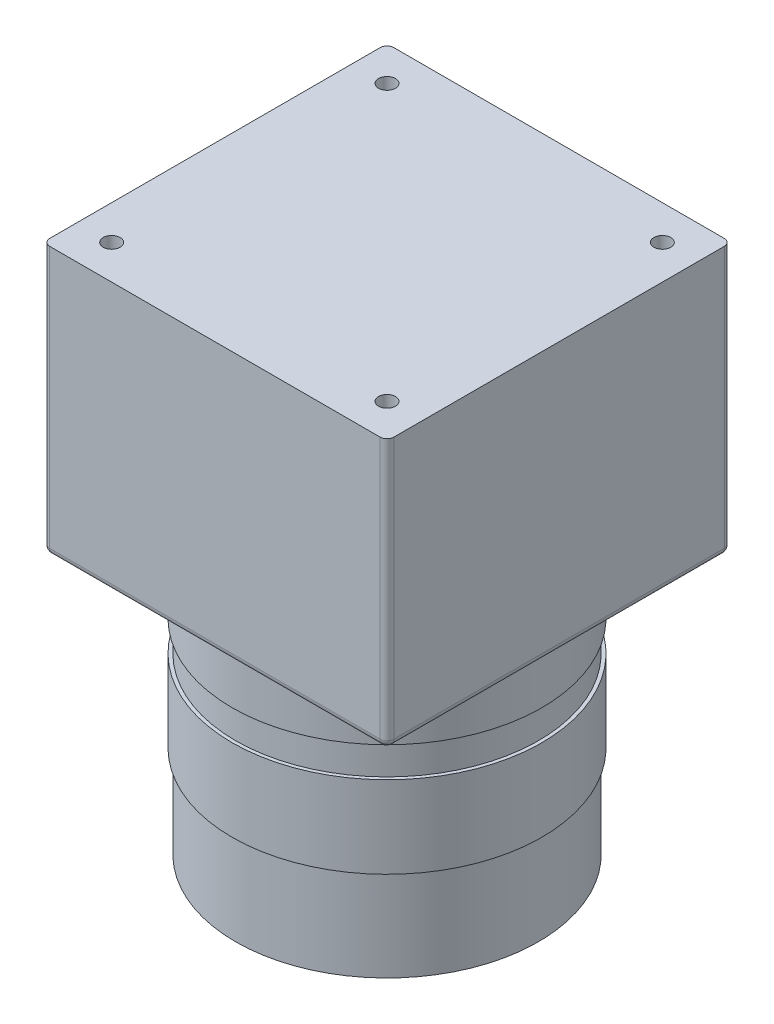
ISO-10303-21;
HEADER;
FILE_DESCRIPTION(('STEP AP214'),'2;1');
FILE_NAME('part.step','',(''),(''),'','','');
FILE_SCHEMA(('AUTOMOTIVE_DESIGN { 1 0 10303 214 1 1 1 1 }'));
ENDSEC;
DATA;
#1=APPLICATION_CONTEXT('core data for automotive mechanical design processes');
#2=APPLICATION_PROTOCOL_DEFINITION('international standard','automotive_design',2000,#1);
#3=PRODUCT_CONTEXT('',#1,'mechanical');
#4=PRODUCT('Part','Part','',(#3));
#5=PRODUCT_RELATED_PRODUCT_CATEGORY('part','',(#4));
#6=PRODUCT_DEFINITION_FORMATION('','',#4);
#7=PRODUCT_DEFINITION_CONTEXT('part definition',#1,'design');
#8=PRODUCT_DEFINITION('design','',#6,#7);
#9=PRODUCT_DEFINITION_SHAPE('','',#8);
#10=(LENGTH_UNIT() NAMED_UNIT(*) SI_UNIT(.MILLI.,.METRE.));
#11=(NAMED_UNIT(*) PLANE_ANGLE_UNIT() SI_UNIT($,.RADIAN.));
#12=(NAMED_UNIT(*) SI_UNIT($,.STERADIAN.) SOLID_ANGLE_UNIT());
#13=UNCERTAINTY_MEASURE_WITH_UNIT(LENGTH_MEASURE(1.E-05),#10,'distance_accuracy_value','');
#14=(GEOMETRIC_REPRESENTATION_CONTEXT(3) GLOBAL_UNCERTAINTY_ASSIGNED_CONTEXT((#13)) GLOBAL_UNIT_ASSIGNED_CONTEXT((#10,
#11,#12)) REPRESENTATION_CONTEXT('',''));
#15=CARTESIAN_POINT('',(0.,0.,0.));
#16=DIRECTION('',(0.,0.,1.));
#17=DIRECTION('',(1.,0.,0.));
#18=AXIS2_PLACEMENT_3D('',#15,#16,#17);
#19=CARTESIAN_POINT('',(0.,47.5,-24.));
#20=DIRECTION('',(1.,0.,0.));
#21=DIRECTION('',(0.,0.,-1.));
#22=AXIS2_PLACEMENT_3D('',#19,#20,#21);
#23=CYLINDRICAL_SURFACE('',#22,1.);
#24=DIRECTION('',(1.,0.,0.));
#25=VECTOR('',#24,1.);
#26=CARTESIAN_POINT('',(0.,46.5,-24.));
#27=LINE('',#26,#25);
#28=CARTESIAN_POINT('',(-24.,46.5,-24.));
#29=VERTEX_POINT('',#28);
#30=CARTESIAN_POINT('',(24.,46.5,-24.));
#31=VERTEX_POINT('',#30);
#32=EDGE_CURVE('E326',#29,#31,#27,.T.);
#33=ORIENTED_EDGE('',*,*,#32,.F.);
#34=CARTESIAN_POINT('',(-24.,47.5,-24.));
#35=DIRECTION('',(1.,0.,0.));
#36=DIRECTION('',(0.,0.,-1.));
#37=AXIS2_PLACEMENT_3D('',#34,#35,#36);
#38=CIRCLE('',#37,1.);
#39=CARTESIAN_POINT('',(-24.,47.5,-25.));
#40=VERTEX_POINT('',#39);
#41=EDGE_CURVE('E341',#29,#40,#38,.T.);
#42=ORIENTED_EDGE('',*,*,#41,.T.);
#43=DIRECTION('',(1.,0.,0.));
#44=VECTOR('',#43,1.);
#45=CARTESIAN_POINT('',(31.5,47.5,-25.));
#46=LINE('',#45,#44);
#47=CARTESIAN_POINT('',(24.,47.5,-25.));
#48=VERTEX_POINT('',#47);
#49=EDGE_CURVE('E330',#48,#40,#46,.F.);
#50=ORIENTED_EDGE('',*,*,#49,.F.);
#51=CARTESIAN_POINT('',(24.,47.5,-24.));
#52=DIRECTION('',(1.,0.,0.));
#53=DIRECTION('',(0.,0.,-1.));
#54=AXIS2_PLACEMENT_3D('',#51,#52,#53);
#55=CIRCLE('',#54,1.);
#56=EDGE_CURVE('E366',#48,#31,#55,.F.);
#57=ORIENTED_EDGE('',*,*,#56,.T.);
#58=EDGE_LOOP('',(#33,#42,#50,#57));
#59=FACE_BOUND('',#58,.T.);
#60=ADVANCED_FACE('F20',(#59),#23,.T.);
#61=CARTESIAN_POINT('',(-24.,47.5,0.));
#62=DIRECTION('',(0.,0.,-1.));
#63=DIRECTION('',(-1.,0.,0.));
#64=AXIS2_PLACEMENT_3D('',#61,#62,#63);
#65=CYLINDRICAL_SURFACE('',#64,1.);
#66=DIRECTION('',(0.,0.,-1.));
#67=VECTOR('',#66,1.);
#68=CARTESIAN_POINT('',(-24.,46.5,0.));
#69=LINE('',#68,#67);
#70=CARTESIAN_POINT('',(-24.,46.5,24.));
#71=VERTEX_POINT('',#70);
#72=EDGE_CURVE('E329',#71,#29,#69,.T.);
#73=ORIENTED_EDGE('',*,*,#72,.F.);
#74=CARTESIAN_POINT('',(-24.,47.5,24.));
#75=DIRECTION('',(0.,0.,-1.));
#76=DIRECTION('',(-1.,0.,0.));
#77=AXIS2_PLACEMENT_3D('',#74,#75,#76);
#78=CIRCLE('',#77,1.);
#79=CARTESIAN_POINT('',(-25.,47.5,24.));
#80=VERTEX_POINT('',#79);
#81=EDGE_CURVE('E29',#71,#80,#78,.T.);
#82=ORIENTED_EDGE('',*,*,#81,.T.);
#83=DIRECTION('',(0.,0.,-1.));
#84=VECTOR('',#83,1.);
#85=CARTESIAN_POINT('',(-25.,47.5,-31.5));
#86=LINE('',#85,#84);
#87=CARTESIAN_POINT('',(-25.,47.5,-24.));
#88=VERTEX_POINT('',#87);
#89=EDGE_CURVE('E43',#88,#80,#86,.F.);
#90=ORIENTED_EDGE('',*,*,#89,.F.);
#91=CARTESIAN_POINT('',(-24.,47.5,-24.));
#92=DIRECTION('',(0.,0.,-1.));
#93=DIRECTION('',(-1.,0.,0.));
#94=AXIS2_PLACEMENT_3D('',#91,#92,#93);
#95=CIRCLE('',#94,1.);
#96=EDGE_CURVE('E347',#88,#29,#95,.F.);
#97=ORIENTED_EDGE('',*,*,#96,.T.);
#98=EDGE_LOOP('',(#73,#82,#90,#97));
#99=FACE_BOUND('',#98,.T.);
#100=ADVANCED_FACE('F197',(#99),#65,.T.);
#101=CARTESIAN_POINT('',(0.,47.5,24.));
#102=DIRECTION('',(-1.,0.,0.));
#103=DIRECTION('',(0.,0.,1.));
#104=AXIS2_PLACEMENT_3D('',#101,#102,#103);
#105=CYLINDRICAL_SURFACE('',#104,1.);
#106=DIRECTION('',(-1.,0.,0.));
#107=VECTOR('',#106,1.);
#108=CARTESIAN_POINT('',(0.,46.5,24.));
#109=LINE('',#108,#107);
#110=CARTESIAN_POINT('',(24.,46.5,24.));
#111=VERTEX_POINT('',#110);
#112=EDGE_CURVE('E168',#111,#71,#109,.T.);
#113=ORIENTED_EDGE('',*,*,#112,.F.);
#114=CARTESIAN_POINT('',(24.,47.5,24.));
#115=DIRECTION('',(-1.,0.,0.));
#116=DIRECTION('',(0.,0.,1.));
#117=AXIS2_PLACEMENT_3D('',#114,#115,#116);
#118=CIRCLE('',#117,1.);
#119=CARTESIAN_POINT('',(24.,47.5,25.));
#120=VERTEX_POINT('',#119);
#121=EDGE_CURVE('E104',#111,#120,#118,.T.);
#122=ORIENTED_EDGE('',*,*,#121,.T.);
#123=DIRECTION('',(-1.,0.,0.));
#124=VECTOR('',#123,1.);
#125=CARTESIAN_POINT('',(-31.5,47.5,25.));
#126=LINE('',#125,#124);
#127=CARTESIAN_POINT('',(-24.,47.5,25.));
#128=VERTEX_POINT('',#127);
#129=EDGE_CURVE('E324',#128,#120,#126,.F.);
#130=ORIENTED_EDGE('',*,*,#129,.F.);
#131=CARTESIAN_POINT('',(-24.,47.5,24.));
#132=DIRECTION('',(-1.,0.,0.));
#133=DIRECTION('',(0.,0.,1.));
#134=AXIS2_PLACEMENT_3D('',#131,#132,#133);
#135=CIRCLE('',#134,1.);
#136=EDGE_CURVE('E85',#128,#71,#135,.F.);
#137=ORIENTED_EDGE('',*,*,#136,.T.);
#138=EDGE_LOOP('',(#113,#122,#130,#137));
#139=FACE_BOUND('',#138,.T.);
#140=ADVANCED_FACE('F204',(#139),#105,.T.);
#141=CARTESIAN_POINT('',(24.,47.5,31.5));
#142=DIRECTION('',(0.,0.,-1.));
#143=DIRECTION('',(-1.,0.,0.));
#144=AXIS2_PLACEMENT_3D('',#141,#142,#143);
#145=CYLINDRICAL_SURFACE('',#144,1.);
#146=DIRECTION('',(0.,0.,-1.));
#147=VECTOR('',#146,1.);
#148=CARTESIAN_POINT('',(25.,47.5,31.5));
#149=LINE('',#148,#147);
#150=CARTESIAN_POINT('',(25.,47.5,24.));
#151=VERTEX_POINT('',#150);
#152=CARTESIAN_POINT('',(25.,47.5,-24.));
#153=VERTEX_POINT('',#152);
#154=EDGE_CURVE('E350',#151,#153,#149,.T.);
#155=ORIENTED_EDGE('',*,*,#154,.F.);
#156=CARTESIAN_POINT('',(24.,47.5,24.));
#157=DIRECTION('',(0.,0.,-1.));
#158=DIRECTION('',(-1.,0.,0.));
#159=AXIS2_PLACEMENT_3D('',#156,#157,#158);
#160=CIRCLE('',#159,1.);
#161=EDGE_CURVE('E151',#151,#111,#160,.T.);
#162=ORIENTED_EDGE('',*,*,#161,.T.);
#163=DIRECTION('',(0.,0.,-1.));
#164=VECTOR('',#163,1.);
#165=CARTESIAN_POINT('',(24.,46.5,0.));
#166=LINE('',#165,#164);
#167=EDGE_CURVE('E353',#31,#111,#166,.F.);
#168=ORIENTED_EDGE('',*,*,#167,.F.);
#169=CARTESIAN_POINT('',(24.,47.5,-24.));
#170=DIRECTION('',(0.,0.,-1.));
#171=DIRECTION('',(-1.,0.,0.));
#172=AXIS2_PLACEMENT_3D('',#169,#170,#171);
#173=CIRCLE('',#172,1.);
#174=EDGE_CURVE('E146',#31,#153,#173,.F.);
#175=ORIENTED_EDGE('',*,*,#174,.T.);
#176=EDGE_LOOP('',(#155,#162,#168,#175));
#177=FACE_BOUND('',#176,.T.);
#178=ADVANCED_FACE('F221',(#177),#145,.T.);
#179=CARTESIAN_POINT('',(0.,46.5,0.));
#180=DIRECTION('',(0.,1.,0.));
#181=DIRECTION('',(0.,0.,1.));
#182=AXIS2_PLACEMENT_3D('',#179,#180,#181);
#183=PLANE('',#182);
#184=ORIENTED_EDGE('',*,*,#72,.T.);
#185=ORIENTED_EDGE('',*,*,#32,.T.);
#186=ORIENTED_EDGE('',*,*,#167,.T.);
#187=ORIENTED_EDGE('',*,*,#112,.T.);
#188=EDGE_LOOP('',(#184,#185,#186,#187));
#189=FACE_BOUND('',#188,.T.);
#190=CARTESIAN_POINT('',(0.,46.5,0.));
#191=DIRECTION('',(0.,1.,0.));
#192=DIRECTION('',(0.,0.,1.));
#193=AXIS2_PLACEMENT_3D('',#190,#191,#192);
#194=CIRCLE('',#193,22.5);
#195=CARTESIAN_POINT('',(0.,46.5,22.5));
#196=VERTEX_POINT('',#195);
#197=EDGE_CURVE('E149',#196,#196,#194,.F.);
#198=ORIENTED_EDGE('',*,*,#197,.F.);
#199=EDGE_LOOP('',(#198));
#200=FACE_BOUND('',#199,.T.);
#201=ADVANCED_FACE('F224',(#189,#200),#183,.F.);
#202=CARTESIAN_POINT('',(0.,0.,0.));
#203=DIRECTION('',(0.,-1.,0.));
#204=DIRECTION('',(0.,0.,-1.));
#205=AXIS2_PLACEMENT_3D('',#202,#203,#204);
#206=CYLINDRICAL_SURFACE('',#205,22.5);
#207=CARTESIAN_POINT('',(0.,38.2,0.));
#208=DIRECTION('',(0.,1.,0.));
#209=DIRECTION('',(0.,0.,1.));
#210=AXIS2_PLACEMENT_3D('',#207,#208,#209);
#211=CIRCLE('',#210,22.5);
#212=CARTESIAN_POINT('',(0.,38.2,22.5));
#213=VERTEX_POINT('',#212);
#214=EDGE_CURVE('E162',#213,#213,#211,.T.);
#215=ORIENTED_EDGE('',*,*,#214,.T.);
#216=EDGE_LOOP('',(#215));
#217=FACE_BOUND('',#216,.T.);
#218=ORIENTED_EDGE('',*,*,#197,.T.);
#219=EDGE_LOOP('',(#218));
#220=FACE_BOUND('',#219,.T.);
#221=ADVANCED_FACE('F282',(#217,#220),#206,.T.);
#222=CARTESIAN_POINT('',(31.5,94.,-25.));
#223=DIRECTION('',(0.,0.,1.));
#224=DIRECTION('',(1.,0.,0.));
#225=AXIS2_PLACEMENT_3D('',#222,#223,#224);
#226=PLANE('',#225);
#227=ORIENTED_EDGE('',*,*,#49,.T.);
#228=DIRECTION('',(0.,1.,0.));
#229=VECTOR('',#228,1.);
#230=CARTESIAN_POINT('',(-24.,94.,-25.));
#231=LINE('',#230,#229);
#232=CARTESIAN_POINT('',(-24.,85.5,-25.));
#233=VERTEX_POINT('',#232);
#234=EDGE_CURVE('E141',#40,#233,#231,.T.);
#235=ORIENTED_EDGE('',*,*,#234,.T.);
#236=DIRECTION('',(-1.,0.,0.));
#237=VECTOR('',#236,1.);
#238=CARTESIAN_POINT('',(31.5,85.5,-25.));
#239=LINE('',#238,#237);
#240=CARTESIAN_POINT('',(24.,85.5,-25.));
#241=VERTEX_POINT('',#240);
#242=EDGE_CURVE('E137',#241,#233,#239,.T.);
#243=ORIENTED_EDGE('',*,*,#242,.F.);
#244=DIRECTION('',(0.,-1.,0.));
#245=VECTOR('',#244,1.);
#246=CARTESIAN_POINT('',(24.,94.,-25.));
#247=LINE('',#246,#245);
#248=EDGE_CURVE('E356',#241,#48,#247,.T.);
#249=ORIENTED_EDGE('',*,*,#248,.T.);
#250=EDGE_LOOP('',(#227,#235,#243,#249));
#251=FACE_BOUND('',#250,.T.);
#252=ADVANCED_FACE('F279',(#251),#226,.F.);
#253=CARTESIAN_POINT('',(-25.,94.,-31.5));
#254=DIRECTION('',(1.,0.,0.));
#255=DIRECTION('',(0.,0.,-1.));
#256=AXIS2_PLACEMENT_3D('',#253,#254,#255);
#257=PLANE('',#256);
#258=ORIENTED_EDGE('',*,*,#89,.T.);
#259=DIRECTION('',(0.,-1.,0.));
#260=VECTOR('',#259,1.);
#261=CARTESIAN_POINT('',(-25.,94.,24.));
#262=LINE('',#261,#260);
#263=CARTESIAN_POINT('',(-25.,85.5,24.));
#264=VERTEX_POINT('',#263);
#265=EDGE_CURVE('E37',#80,#264,#262,.F.);
#266=ORIENTED_EDGE('',*,*,#265,.T.);
#267=DIRECTION('',(0.,0.,1.));
#268=VECTOR('',#267,1.);
#269=CARTESIAN_POINT('',(-25.,85.5,-31.5));
#270=LINE('',#269,#268);
#271=CARTESIAN_POINT('',(-25.,85.5,-24.));
#272=VERTEX_POINT('',#271);
#273=EDGE_CURVE('E82',#272,#264,#270,.T.);
#274=ORIENTED_EDGE('',*,*,#273,.F.);
#275=DIRECTION('',(0.,1.,0.));
#276=VECTOR('',#275,1.);
#277=CARTESIAN_POINT('',(-25.,94.,-24.));
#278=LINE('',#277,#276);
#279=EDGE_CURVE('E140',#272,#88,#278,.F.);
#280=ORIENTED_EDGE('',*,*,#279,.T.);
#281=EDGE_LOOP('',(#258,#266,#274,#280));
#282=FACE_BOUND('',#281,.T.);
#283=ADVANCED_FACE('F276',(#282),#257,.F.);
#284=CARTESIAN_POINT('',(-31.5,94.,25.));
#285=DIRECTION('',(0.,0.,-1.));
#286=DIRECTION('',(-1.,0.,0.));
#287=AXIS2_PLACEMENT_3D('',#284,#285,#286);
#288=PLANE('',#287);
#289=ORIENTED_EDGE('',*,*,#129,.T.);
#290=DIRECTION('',(0.,-1.,0.));
#291=VECTOR('',#290,1.);
#292=CARTESIAN_POINT('',(24.,94.,25.));
#293=LINE('',#292,#291);
#294=CARTESIAN_POINT('',(24.,85.5,25.));
#295=VERTEX_POINT('',#294);
#296=EDGE_CURVE('E94',#120,#295,#293,.F.);
#297=ORIENTED_EDGE('',*,*,#296,.T.);
#298=DIRECTION('',(1.,0.,0.));
#299=VECTOR('',#298,1.);
#300=CARTESIAN_POINT('',(-31.5,85.5,25.));
#301=LINE('',#300,#299);
#302=CARTESIAN_POINT('',(-24.,85.5,25.));
#303=VERTEX_POINT('',#302);
#304=EDGE_CURVE('E80',#303,#295,#301,.T.);
#305=ORIENTED_EDGE('',*,*,#304,.F.);
#306=DIRECTION('',(0.,-1.,0.));
#307=VECTOR('',#306,1.);
#308=CARTESIAN_POINT('',(-24.,94.,25.));
#309=LINE('',#308,#307);
#310=EDGE_CURVE('E91',#303,#128,#309,.T.);
#311=ORIENTED_EDGE('',*,*,#310,.T.);
#312=EDGE_LOOP('',(#289,#297,#305,#311));
#313=FACE_BOUND('',#312,.T.);
#314=ADVANCED_FACE('F90',(#313),#288,.F.);
#315=CARTESIAN_POINT('',(25.,94.,31.5));
#316=DIRECTION('',(-1.,0.,0.));
#317=DIRECTION('',(0.,0.,1.));
#318=AXIS2_PLACEMENT_3D('',#315,#316,#317);
#319=PLANE('',#318);
#320=DIRECTION('',(0.,-1.,0.));
#321=VECTOR('',#320,1.);
#322=CARTESIAN_POINT('',(25.,94.,24.));
#323=LINE('',#322,#321);
#324=CARTESIAN_POINT('',(25.,85.5,24.));
#325=VERTEX_POINT('',#324);
#326=EDGE_CURVE('E369',#325,#151,#323,.T.);
#327=ORIENTED_EDGE('',*,*,#326,.T.);
#328=ORIENTED_EDGE('',*,*,#154,.T.);
#329=DIRECTION('',(0.,-1.,0.));
#330=VECTOR('',#329,1.);
#331=CARTESIAN_POINT('',(25.,94.,-24.));
#332=LINE('',#331,#330);
#333=CARTESIAN_POINT('',(25.,85.5,-24.));
#334=VERTEX_POINT('',#333);
#335=EDGE_CURVE('E147',#153,#334,#332,.F.);
#336=ORIENTED_EDGE('',*,*,#335,.T.);
#337=DIRECTION('',(0.,0.,-1.));
#338=VECTOR('',#337,1.);
#339=CARTESIAN_POINT('',(25.,85.5,31.5));
#340=LINE('',#339,#338);
#341=EDGE_CURVE('E96',#325,#334,#340,.T.);
#342=ORIENTED_EDGE('',*,*,#341,.F.);
#343=EDGE_LOOP('',(#327,#328,#336,#342));
#344=FACE_BOUND('',#343,.T.);
#345=ADVANCED_FACE('F264',(#344),#319,.F.);
#346=CARTESIAN_POINT('',(0.,85.5,0.));
#347=DIRECTION('',(0.,1.,0.));
#348=DIRECTION('',(0.,0.,1.));
#349=AXIS2_PLACEMENT_3D('',#346,#347,#348);
#350=PLANE('',#349);
#351=CARTESIAN_POINT('',(-20.,85.5,20.));
#352=DIRECTION('',(0.,1.,0.));
#353=DIRECTION('',(0.,0.,1.));
#354=AXIS2_PLACEMENT_3D('',#351,#352,#353);
#355=CIRCLE('',#354,1.2295);
#356=CARTESIAN_POINT('',(-20.,85.5,21.2295));
#357=VERTEX_POINT('',#356);
#358=EDGE_CURVE('E120',#357,#357,#355,.F.);
#359=ORIENTED_EDGE('',*,*,#358,.T.);
#360=EDGE_LOOP('',(#359));
#361=FACE_BOUND('',#360,.T.);
#362=CARTESIAN_POINT('',(-20.,85.5,-20.));
#363=DIRECTION('',(0.,1.,0.));
#364=DIRECTION('',(0.,0.,1.));
#365=AXIS2_PLACEMENT_3D('',#362,#363,#364);
#366=CIRCLE('',#365,1.2295);
#367=CARTESIAN_POINT('',(-20.,85.5,-18.7705));
#368=VERTEX_POINT('',#367);
#369=EDGE_CURVE('E125',#368,#368,#366,.F.);
#370=ORIENTED_EDGE('',*,*,#369,.T.);
#371=EDGE_LOOP('',(#370));
#372=FACE_BOUND('',#371,.T.);
#373=CARTESIAN_POINT('',(20.,85.5,20.));
#374=DIRECTION('',(0.,1.,0.));
#375=DIRECTION('',(0.,0.,1.));
#376=AXIS2_PLACEMENT_3D('',#373,#374,#375);
#377=CIRCLE('',#376,1.2295);
#378=CARTESIAN_POINT('',(20.,85.5,21.2295));
#379=VERTEX_POINT('',#378);
#380=EDGE_CURVE('E115',#379,#379,#377,.F.);
#381=ORIENTED_EDGE('',*,*,#380,.T.);
#382=EDGE_LOOP('',(#381));
#383=FACE_BOUND('',#382,.T.);
#384=CARTESIAN_POINT('',(20.,85.5,-20.));
#385=DIRECTION('',(0.,1.,0.));
#386=DIRECTION('',(0.,0.,1.));
#387=AXIS2_PLACEMENT_3D('',#384,#385,#386);
#388=CIRCLE('',#387,1.2295);
#389=CARTESIAN_POINT('',(20.,85.5,-18.7705));
#390=VERTEX_POINT('',#389);
#391=EDGE_CURVE('E114',#390,#390,#388,.F.);
#392=ORIENTED_EDGE('',*,*,#391,.T.);
#393=EDGE_LOOP('',(#392));
#394=FACE_BOUND('',#393,.T.);
#395=ORIENTED_EDGE('',*,*,#273,.T.);
#396=CARTESIAN_POINT('',(-24.,85.5,24.));
#397=DIRECTION('',(0.,1.,0.));
#398=DIRECTION('',(0.,0.,1.));
#399=AXIS2_PLACEMENT_3D('',#396,#397,#398);
#400=CIRCLE('',#399,1.);
#401=EDGE_CURVE('E77',#264,#303,#400,.T.);
#402=ORIENTED_EDGE('',*,*,#401,.T.);
#403=ORIENTED_EDGE('',*,*,#304,.T.);
#404=CARTESIAN_POINT('',(24.,85.5,24.));
#405=DIRECTION('',(0.,1.,0.));
#406=DIRECTION('',(0.,0.,1.));
#407=AXIS2_PLACEMENT_3D('',#404,#405,#406);
#408=CIRCLE('',#407,1.);
#409=EDGE_CURVE('E150',#295,#325,#408,.T.);
#410=ORIENTED_EDGE('',*,*,#409,.T.);
#411=ORIENTED_EDGE('',*,*,#341,.T.);
#412=CARTESIAN_POINT('',(24.,85.5,-24.));
#413=DIRECTION('',(0.,1.,0.));
#414=DIRECTION('',(0.,0.,1.));
#415=AXIS2_PLACEMENT_3D('',#412,#413,#414);
#416=CIRCLE('',#415,1.);
#417=EDGE_CURVE('E144',#334,#241,#416,.T.);
#418=ORIENTED_EDGE('',*,*,#417,.T.);
#419=ORIENTED_EDGE('',*,*,#242,.T.);
#420=CARTESIAN_POINT('',(-24.,85.5,-24.));
#421=DIRECTION('',(0.,1.,0.));
#422=DIRECTION('',(0.,0.,1.));
#423=AXIS2_PLACEMENT_3D('',#420,#421,#422);
#424=CIRCLE('',#423,1.);
#425=EDGE_CURVE('E138',#233,#272,#424,.T.);
#426=ORIENTED_EDGE('',*,*,#425,.T.);
#427=EDGE_LOOP('',(#395,#402,#403,#410,#411,#418,#419,#426));
#428=FACE_BOUND('',#427,.T.);
#429=ADVANCED_FACE('F79',(#361,#372,#383,#394,#428),#350,.T.);
#430=CARTESIAN_POINT('',(0.,33.7,0.));
#431=DIRECTION('',(0.,1.,0.));
#432=DIRECTION('',(0.,0.,1.));
#433=AXIS2_PLACEMENT_3D('',#430,#431,#432);
#434=CYLINDRICAL_SURFACE('',#433,22.);
#435=CARTESIAN_POINT('',(0.,33.8,0.));
#436=DIRECTION('',(0.,1.,0.));
#437=DIRECTION('',(0.,0.,1.));
#438=AXIS2_PLACEMENT_3D('',#435,#436,#437);
#439=CIRCLE('',#438,22.);
#440=CARTESIAN_POINT('',(0.,33.8,22.));
#441=VERTEX_POINT('',#440);
#442=EDGE_CURVE('E143',#441,#441,#439,.T.);
#443=ORIENTED_EDGE('',*,*,#442,.T.);
#444=EDGE_LOOP('',(#443));
#445=FACE_BOUND('',#444,.T.);
#446=CARTESIAN_POINT('',(0.,38.2,0.));
#447=DIRECTION('',(0.,1.,0.));
#448=DIRECTION('',(0.,0.,1.));
#449=AXIS2_PLACEMENT_3D('',#446,#447,#448);
#450=CIRCLE('',#449,22.);
#451=CARTESIAN_POINT('',(0.,38.2,22.));
#452=VERTEX_POINT('',#451);
#453=EDGE_CURVE('E157',#452,#452,#450,.T.);
#454=ORIENTED_EDGE('',*,*,#453,.F.);
#455=EDGE_LOOP('',(#454));
#456=FACE_BOUND('',#455,.T.);
#457=ADVANCED_FACE('F263',(#445,#456),#434,.T.);
#458=CARTESIAN_POINT('',(0.,33.8,0.));
#459=DIRECTION('',(0.,1.,0.));
#460=DIRECTION('',(0.,0.,1.));
#461=AXIS2_PLACEMENT_3D('',#458,#459,#460);
#462=PLANE('',#461);
#463=ORIENTED_EDGE('',*,*,#442,.F.);
#464=EDGE_LOOP('',(#463));
#465=FACE_BOUND('',#464,.T.);
#466=CARTESIAN_POINT('',(0.,33.8,0.));
#467=DIRECTION('',(0.,1.,0.));
#468=DIRECTION('',(0.,0.,1.));
#469=AXIS2_PLACEMENT_3D('',#466,#467,#468);
#470=CIRCLE('',#469,22.5);
#471=CARTESIAN_POINT('',(0.,33.8,22.5));
#472=VERTEX_POINT('',#471);
#473=EDGE_CURVE('E161',#472,#472,#470,.T.);
#474=ORIENTED_EDGE('',*,*,#473,.T.);
#475=EDGE_LOOP('',(#474));
#476=FACE_BOUND('',#475,.T.);
#477=ADVANCED_FACE('F173',(#465,#476),#462,.T.);
#478=CARTESIAN_POINT('',(0.,38.2,0.));
#479=DIRECTION('',(0.,1.,0.));
#480=DIRECTION('',(0.,0.,1.));
#481=AXIS2_PLACEMENT_3D('',#478,#479,#480);
#482=PLANE('',#481);
#483=ORIENTED_EDGE('',*,*,#453,.T.);
#484=EDGE_LOOP('',(#483));
#485=FACE_BOUND('',#484,.T.);
#486=ORIENTED_EDGE('',*,*,#214,.F.);
#487=EDGE_LOOP('',(#486));
#488=FACE_BOUND('',#487,.T.);
#489=ADVANCED_FACE('F178',(#485,#488),#482,.F.);
#490=CARTESIAN_POINT('',(0.,0.,0.));
#491=DIRECTION('',(0.,-1.,0.));
#492=DIRECTION('',(0.,0.,-1.));
#493=AXIS2_PLACEMENT_3D('',#490,#491,#492);
#494=CYLINDRICAL_SURFACE('',#493,22.5);
#495=CARTESIAN_POINT('',(0.,21.9,0.));
#496=DIRECTION('',(0.,1.,0.));
#497=DIRECTION('',(0.,0.,1.));
#498=AXIS2_PLACEMENT_3D('',#495,#496,#497);
#499=CIRCLE('',#498,22.5);
#500=CARTESIAN_POINT('',(0.,21.9,22.5));
#501=VERTEX_POINT('',#500);
#502=EDGE_CURVE('E119',#501,#501,#499,.T.);
#503=ORIENTED_EDGE('',*,*,#502,.T.);
#504=EDGE_LOOP('',(#503));
#505=FACE_BOUND('',#504,.T.);
#506=ORIENTED_EDGE('',*,*,#473,.F.);
#507=EDGE_LOOP('',(#506));
#508=FACE_BOUND('',#507,.T.);
#509=ADVANCED_FACE('F175',(#505,#508),#494,.T.);
#510=CARTESIAN_POINT('',(0.,-4.57192132356772,0.));
#511=DIRECTION('',(0.,1.,0.));
#512=DIRECTION('',(0.,0.,1.));
#513=AXIS2_PLACEMENT_3D('',#510,#511,#512);
#514=CYLINDRICAL_SURFACE('',#513,22.);
#515=CARTESIAN_POINT('',(0.,8.5,0.));
#516=DIRECTION('',(0.,-1.,0.));
#517=DIRECTION('',(0.,0.,-1.));
#518=AXIS2_PLACEMENT_3D('',#515,#516,#517);
#519=CIRCLE('',#518,22.);
#520=CARTESIAN_POINT('',(0.,8.5,-22.));
#521=VERTEX_POINT('',#520);
#522=EDGE_CURVE('E24',#521,#521,#519,.T.);
#523=ORIENTED_EDGE('',*,*,#522,.F.);
#524=EDGE_LOOP('',(#523));
#525=FACE_BOUND('',#524,.T.);
#526=CARTESIAN_POINT('',(0.,21.9,0.));
#527=DIRECTION('',(0.,1.,0.));
#528=DIRECTION('',(0.,0.,1.));
#529=AXIS2_PLACEMENT_3D('',#526,#527,#528);
#530=CIRCLE('',#529,22.);
#531=CARTESIAN_POINT('',(0.,21.9,22.));
#532=VERTEX_POINT('',#531);
#533=EDGE_CURVE('E315',#532,#532,#530,.T.);
#534=ORIENTED_EDGE('',*,*,#533,.F.);
#535=EDGE_LOOP('',(#534));
#536=FACE_BOUND('',#535,.T.);
#537=ADVANCED_FACE('F177',(#525,#536),#514,.T.);
#538=CARTESIAN_POINT('',(0.,21.9,0.));
#539=DIRECTION('',(0.,1.,0.));
#540=DIRECTION('',(0.,0.,1.));
#541=AXIS2_PLACEMENT_3D('',#538,#539,#540);
#542=PLANE('',#541);
#543=ORIENTED_EDGE('',*,*,#533,.T.);
#544=EDGE_LOOP('',(#543));
#545=FACE_BOUND('',#544,.T.);
#546=ORIENTED_EDGE('',*,*,#502,.F.);
#547=EDGE_LOOP('',(#546));
#548=FACE_BOUND('',#547,.T.);
#549=ADVANCED_FACE('F187',(#545,#548),#542,.F.);
#550=CARTESIAN_POINT('',(0.,8.5,0.));
#551=DIRECTION('',(0.,-1.,0.));
#552=DIRECTION('',(0.,0.,-1.));
#553=AXIS2_PLACEMENT_3D('',#550,#551,#552);
#554=PLANE('',#553);
#555=ORIENTED_EDGE('',*,*,#522,.T.);
#556=EDGE_LOOP('',(#555));
#557=FACE_BOUND('',#556,.T.);
#558=ADVANCED_FACE('F22',(#557),#554,.T.);
#559=CARTESIAN_POINT('',(20.,86.,-20.));
#560=DIRECTION('',(0.,1.,0.));
#561=DIRECTION('',(0.,0.,1.));
#562=AXIS2_PLACEMENT_3D('',#559,#560,#561);
#563=CYLINDRICAL_SURFACE('',#562,1.2295);
#564=CARTESIAN_POINT('',(20.,77.5,-20.));
#565=DIRECTION('',(0.,-1.,0.));
#566=DIRECTION('',(0.,0.,-1.));
#567=AXIS2_PLACEMENT_3D('',#564,#565,#566);
#568=CIRCLE('',#567,1.2295);
#569=CARTESIAN_POINT('',(20.,77.5,-21.2295));
#570=VERTEX_POINT('',#569);
#571=EDGE_CURVE('E116',#570,#570,#568,.T.);
#572=ORIENTED_EDGE('',*,*,#571,.T.);
#573=EDGE_LOOP('',(#572));
#574=FACE_BOUND('',#573,.T.);
#575=ORIENTED_EDGE('',*,*,#391,.F.);
#576=EDGE_LOOP('',(#575));
#577=FACE_BOUND('',#576,.T.);
#578=ADVANCED_FACE('F268',(#574,#577),#563,.F.);
#579=CARTESIAN_POINT('',(20.,77.5,-20.));
#580=DIRECTION('',(0.,-1.,0.));
#581=DIRECTION('',(0.,0.,-1.));
#582=AXIS2_PLACEMENT_3D('',#579,#580,#581);
#583=PLANE('',#582);
#584=ORIENTED_EDGE('',*,*,#571,.F.);
#585=EDGE_LOOP('',(#584));
#586=FACE_BOUND('',#585,.T.);
#587=ADVANCED_FACE('F266',(#586),#583,.F.);
#588=CARTESIAN_POINT('',(20.,86.,20.));
#589=DIRECTION('',(0.,1.,0.));
#590=DIRECTION('',(0.,0.,1.));
#591=AXIS2_PLACEMENT_3D('',#588,#589,#590);
#592=CYLINDRICAL_SURFACE('',#591,1.2295);
#593=CARTESIAN_POINT('',(20.,77.5,20.));
#594=DIRECTION('',(0.,-1.,0.));
#595=DIRECTION('',(0.,0.,-1.));
#596=AXIS2_PLACEMENT_3D('',#593,#594,#595);
#597=CIRCLE('',#596,1.2295);
#598=CARTESIAN_POINT('',(20.,77.5,18.7705));
#599=VERTEX_POINT('',#598);
#600=EDGE_CURVE('E111',#599,#599,#597,.T.);
#601=ORIENTED_EDGE('',*,*,#600,.T.);
#602=EDGE_LOOP('',(#601));
#603=FACE_BOUND('',#602,.T.);
#604=ORIENTED_EDGE('',*,*,#380,.F.);
#605=EDGE_LOOP('',(#604));
#606=FACE_BOUND('',#605,.T.);
#607=ADVANCED_FACE('F251',(#603,#606),#592,.F.);
#608=CARTESIAN_POINT('',(20.,77.5,20.));
#609=DIRECTION('',(0.,-1.,0.));
#610=DIRECTION('',(0.,0.,-1.));
#611=AXIS2_PLACEMENT_3D('',#608,#609,#610);
#612=PLANE('',#611);
#613=ORIENTED_EDGE('',*,*,#600,.F.);
#614=EDGE_LOOP('',(#613));
#615=FACE_BOUND('',#614,.T.);
#616=ADVANCED_FACE('F247',(#615),#612,.F.);
#617=CARTESIAN_POINT('',(-20.,86.,-20.));
#618=DIRECTION('',(0.,1.,0.));
#619=DIRECTION('',(0.,0.,1.));
#620=AXIS2_PLACEMENT_3D('',#617,#618,#619);
#621=CYLINDRICAL_SURFACE('',#620,1.2295);
#622=CARTESIAN_POINT('',(-20.,77.5,-20.));
#623=DIRECTION('',(0.,-1.,0.));
#624=DIRECTION('',(0.,0.,-1.));
#625=AXIS2_PLACEMENT_3D('',#622,#623,#624);
#626=CIRCLE('',#625,1.2295);
#627=CARTESIAN_POINT('',(-20.,77.5,-21.2295));
#628=VERTEX_POINT('',#627);
#629=EDGE_CURVE('E129',#628,#628,#626,.T.);
#630=ORIENTED_EDGE('',*,*,#629,.T.);
#631=EDGE_LOOP('',(#630));
#632=FACE_BOUND('',#631,.T.);
#633=ORIENTED_EDGE('',*,*,#369,.F.);
#634=EDGE_LOOP('',(#633));
#635=FACE_BOUND('',#634,.T.);
#636=ADVANCED_FACE('F250',(#632,#635),#621,.F.);
#637=CARTESIAN_POINT('',(-20.,77.5,-20.));
#638=DIRECTION('',(0.,-1.,0.));
#639=DIRECTION('',(0.,0.,-1.));
#640=AXIS2_PLACEMENT_3D('',#637,#638,#639);
#641=PLANE('',#640);
#642=ORIENTED_EDGE('',*,*,#629,.F.);
#643=EDGE_LOOP('',(#642));
#644=FACE_BOUND('',#643,.T.);
#645=ADVANCED_FACE('F253',(#644),#641,.F.);
#646=CARTESIAN_POINT('',(-20.,86.,20.));
#647=DIRECTION('',(0.,1.,0.));
#648=DIRECTION('',(0.,0.,1.));
#649=AXIS2_PLACEMENT_3D('',#646,#647,#648);
#650=CYLINDRICAL_SURFACE('',#649,1.2295);
#651=CARTESIAN_POINT('',(-20.,77.5,20.));
#652=DIRECTION('',(0.,-1.,0.));
#653=DIRECTION('',(0.,0.,-1.));
#654=AXIS2_PLACEMENT_3D('',#651,#652,#653);
#655=CIRCLE('',#654,1.2295);
#656=CARTESIAN_POINT('',(-20.,77.5,18.7705));
#657=VERTEX_POINT('',#656);
#658=EDGE_CURVE('E124',#657,#657,#655,.T.);
#659=ORIENTED_EDGE('',*,*,#658,.T.);
#660=EDGE_LOOP('',(#659));
#661=FACE_BOUND('',#660,.T.);
#662=ORIENTED_EDGE('',*,*,#358,.F.);
#663=EDGE_LOOP('',(#662));
#664=FACE_BOUND('',#663,.T.);
#665=ADVANCED_FACE('F256',(#661,#664),#650,.F.);
#666=CARTESIAN_POINT('',(-20.,77.5,20.));
#667=DIRECTION('',(0.,-1.,0.));
#668=DIRECTION('',(0.,0.,-1.));
#669=AXIS2_PLACEMENT_3D('',#666,#667,#668);
#670=PLANE('',#669);
#671=ORIENTED_EDGE('',*,*,#658,.F.);
#672=EDGE_LOOP('',(#671));
#673=FACE_BOUND('',#672,.T.);
#674=ADVANCED_FACE('F215',(#673),#670,.F.);
#675=CARTESIAN_POINT('',(-24.,94.,-24.));
#676=DIRECTION('',(0.,1.,0.));
#677=DIRECTION('',(0.,0.,1.));
#678=AXIS2_PLACEMENT_3D('',#675,#676,#677);
#679=CYLINDRICAL_SURFACE('',#678,1.);
#680=ORIENTED_EDGE('',*,*,#234,.F.);
#681=CARTESIAN_POINT('',(-24.,47.5,-24.));
#682=DIRECTION('',(0.,1.,0.));
#683=DIRECTION('',(0.,0.,1.));
#684=AXIS2_PLACEMENT_3D('',#681,#682,#683);
#685=CIRCLE('',#684,1.);
#686=EDGE_CURVE('E344',#40,#88,#685,.T.);
#687=ORIENTED_EDGE('',*,*,#686,.T.);
#688=ORIENTED_EDGE('',*,*,#279,.F.);
#689=ORIENTED_EDGE('',*,*,#425,.F.);
#690=EDGE_LOOP('',(#680,#687,#688,#689));
#691=FACE_BOUND('',#690,.T.);
#692=ADVANCED_FACE('F211',(#691),#679,.T.);
#693=CARTESIAN_POINT('',(-24.,47.5,-24.));
#694=DIRECTION('',(0.,0.,1.));
#695=DIRECTION('',(1.,0.,0.));
#696=AXIS2_PLACEMENT_3D('',#693,#694,#695);
#697=SPHERICAL_SURFACE('',#696,1.);
#698=ORIENTED_EDGE('',*,*,#96,.F.);
#699=ORIENTED_EDGE('',*,*,#686,.F.);
#700=ORIENTED_EDGE('',*,*,#41,.F.);
#701=EDGE_LOOP('',(#698,#699,#700));
#702=FACE_BOUND('',#701,.T.);
#703=ADVANCED_FACE('F214',(#702),#697,.T.);
#704=CARTESIAN_POINT('',(24.,94.,-24.));
#705=DIRECTION('',(0.,-1.,0.));
#706=DIRECTION('',(0.,0.,-1.));
#707=AXIS2_PLACEMENT_3D('',#704,#705,#706);
#708=CYLINDRICAL_SURFACE('',#707,1.);
#709=ORIENTED_EDGE('',*,*,#335,.F.);
#710=CARTESIAN_POINT('',(24.,47.5,-24.));
#711=DIRECTION('',(0.,-1.,0.));
#712=DIRECTION('',(0.,0.,-1.));
#713=AXIS2_PLACEMENT_3D('',#710,#711,#712);
#714=CIRCLE('',#713,1.);
#715=EDGE_CURVE('E363',#153,#48,#714,.F.);
#716=ORIENTED_EDGE('',*,*,#715,.T.);
#717=ORIENTED_EDGE('',*,*,#248,.F.);
#718=ORIENTED_EDGE('',*,*,#417,.F.);
#719=EDGE_LOOP('',(#709,#716,#717,#718));
#720=FACE_BOUND('',#719,.T.);
#721=ADVANCED_FACE('F219',(#720),#708,.T.);
#722=CARTESIAN_POINT('',(24.,47.5,-24.));
#723=DIRECTION('',(0.,0.,1.));
#724=DIRECTION('',(1.,0.,0.));
#725=AXIS2_PLACEMENT_3D('',#722,#723,#724);
#726=SPHERICAL_SURFACE('',#725,1.);
#727=ORIENTED_EDGE('',*,*,#56,.F.);
#728=ORIENTED_EDGE('',*,*,#715,.F.);
#729=ORIENTED_EDGE('',*,*,#174,.F.);
#730=EDGE_LOOP('',(#727,#728,#729));
#731=FACE_BOUND('',#730,.T.);
#732=ADVANCED_FACE('F228',(#731),#726,.T.);
#733=CARTESIAN_POINT('',(24.,94.,24.));
#734=DIRECTION('',(0.,-1.,0.));
#735=DIRECTION('',(0.,0.,-1.));
#736=AXIS2_PLACEMENT_3D('',#733,#734,#735);
#737=CYLINDRICAL_SURFACE('',#736,1.);
#738=ORIENTED_EDGE('',*,*,#296,.F.);
#739=CARTESIAN_POINT('',(24.,47.5,24.));
#740=DIRECTION('',(0.,-1.,0.));
#741=DIRECTION('',(0.,0.,-1.));
#742=AXIS2_PLACEMENT_3D('',#739,#740,#741);
#743=CIRCLE('',#742,1.);
#744=EDGE_CURVE('E100',#120,#151,#743,.F.);
#745=ORIENTED_EDGE('',*,*,#744,.T.);
#746=ORIENTED_EDGE('',*,*,#326,.F.);
#747=ORIENTED_EDGE('',*,*,#409,.F.);
#748=EDGE_LOOP('',(#738,#745,#746,#747));
#749=FACE_BOUND('',#748,.T.);
#750=ADVANCED_FACE('F232',(#749),#737,.T.);
#751=CARTESIAN_POINT('',(24.,47.5,24.));
#752=DIRECTION('',(0.,0.,1.));
#753=DIRECTION('',(1.,0.,0.));
#754=AXIS2_PLACEMENT_3D('',#751,#752,#753);
#755=SPHERICAL_SURFACE('',#754,1.);
#756=ORIENTED_EDGE('',*,*,#161,.F.);
#757=ORIENTED_EDGE('',*,*,#744,.F.);
#758=ORIENTED_EDGE('',*,*,#121,.F.);
#759=EDGE_LOOP('',(#756,#757,#758));
#760=FACE_BOUND('',#759,.T.);
#761=ADVANCED_FACE('F236',(#760),#755,.T.);
#762=CARTESIAN_POINT('',(-24.,94.,24.));
#763=DIRECTION('',(0.,-1.,0.));
#764=DIRECTION('',(0.,0.,-1.));
#765=AXIS2_PLACEMENT_3D('',#762,#763,#764);
#766=CYLINDRICAL_SURFACE('',#765,1.);
#767=ORIENTED_EDGE('',*,*,#265,.F.);
#768=CARTESIAN_POINT('',(-24.,47.5,24.));
#769=DIRECTION('',(0.,-1.,0.));
#770=DIRECTION('',(0.,0.,-1.));
#771=AXIS2_PLACEMENT_3D('',#768,#769,#770);
#772=CIRCLE('',#771,1.);
#773=EDGE_CURVE('E12',#80,#128,#772,.F.);
#774=ORIENTED_EDGE('',*,*,#773,.T.);
#775=ORIENTED_EDGE('',*,*,#310,.F.);
#776=ORIENTED_EDGE('',*,*,#401,.F.);
#777=EDGE_LOOP('',(#767,#774,#775,#776));
#778=FACE_BOUND('',#777,.T.);
#779=ADVANCED_FACE('F98',(#778),#766,.T.);
#780=CARTESIAN_POINT('',(-24.,47.5,24.));
#781=DIRECTION('',(0.,0.,1.));
#782=DIRECTION('',(1.,0.,0.));
#783=AXIS2_PLACEMENT_3D('',#780,#781,#782);
#784=SPHERICAL_SURFACE('',#783,1.);
#785=ORIENTED_EDGE('',*,*,#136,.F.);
#786=ORIENTED_EDGE('',*,*,#773,.F.);
#787=ORIENTED_EDGE('',*,*,#81,.F.);
#788=EDGE_LOOP('',(#785,#786,#787));
#789=FACE_BOUND('',#788,.T.);
#790=ADVANCED_FACE('F243',(#789),#784,.T.);
#791=CLOSED_SHELL('',(#60,#100,#140,#178,#201,#221,#252,#283,#314,#345,#429,#457,#477,#489,#509,
#537,#549,#558,#578,#587,#607,#616,#636,#645,#665,#674,#692,#703,#721,#732,#750,#761,#779,#790));
#792=MANIFOLD_SOLID_BREP('B1',#791);
#793=ADVANCED_BREP_SHAPE_REPRESENTATION('',(#18,#792),#14);
#794=SHAPE_DEFINITION_REPRESENTATION(#9,#793);
ENDSEC;
END-ISO-10303-21;
